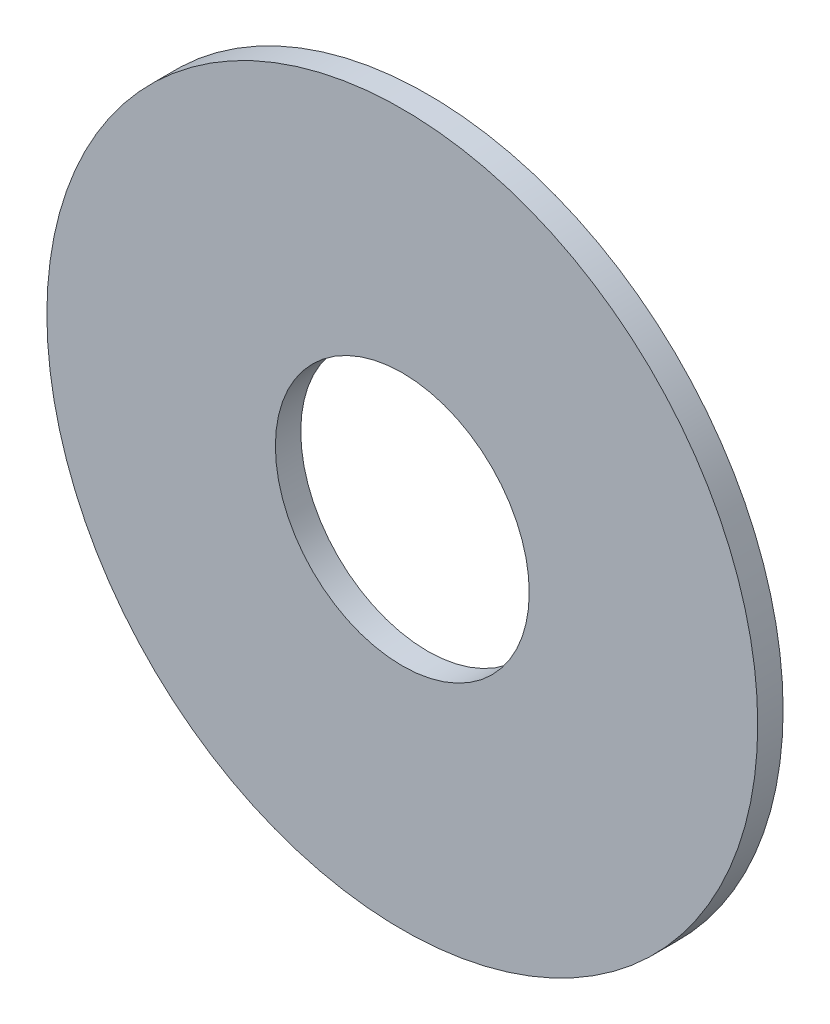
ISO-10303-21;
HEADER;
FILE_DESCRIPTION(('STEP AP214'),'2;1');
FILE_NAME('part.step','',(''),(''),'','','');
FILE_SCHEMA(('AUTOMOTIVE_DESIGN { 1 0 10303 214 1 1 1 1 }'));
ENDSEC;
DATA;
#1=APPLICATION_CONTEXT('core data for automotive mechanical design processes');
#2=APPLICATION_PROTOCOL_DEFINITION('international standard','automotive_design',2000,#1);
#3=PRODUCT_CONTEXT('',#1,'mechanical');
#4=PRODUCT('Part','Part','',(#3));
#5=PRODUCT_RELATED_PRODUCT_CATEGORY('part','',(#4));
#6=PRODUCT_DEFINITION_FORMATION('','',#4);
#7=PRODUCT_DEFINITION_CONTEXT('part definition',#1,'design');
#8=PRODUCT_DEFINITION('design','',#6,#7);
#9=PRODUCT_DEFINITION_SHAPE('','',#8);
#10=(LENGTH_UNIT() NAMED_UNIT(*) SI_UNIT(.MILLI.,.METRE.));
#11=(NAMED_UNIT(*) PLANE_ANGLE_UNIT() SI_UNIT($,.RADIAN.));
#12=(NAMED_UNIT(*) SI_UNIT($,.STERADIAN.) SOLID_ANGLE_UNIT());
#13=UNCERTAINTY_MEASURE_WITH_UNIT(LENGTH_MEASURE(1.E-05),#10,'distance_accuracy_value','');
#14=(GEOMETRIC_REPRESENTATION_CONTEXT(3) GLOBAL_UNCERTAINTY_ASSIGNED_CONTEXT((#13)) GLOBAL_UNIT_ASSIGNED_CONTEXT((#10,
#11,#12)) REPRESENTATION_CONTEXT('',''));
#15=CARTESIAN_POINT('',(0.,0.,0.));
#16=DIRECTION('',(0.,0.,1.));
#17=DIRECTION('',(1.,0.,0.));
#18=AXIS2_PLACEMENT_3D('',#15,#16,#17);
#19=CARTESIAN_POINT('',(0.,0.,10.));
#20=DIRECTION('',(0.,0.,1.));
#21=DIRECTION('',(1.,0.,0.));
#22=AXIS2_PLACEMENT_3D('',#19,#20,#21);
#23=PLANE('',#22);
#24=CARTESIAN_POINT('',(0.,0.,10.));
#25=DIRECTION('',(0.,0.,1.));
#26=DIRECTION('',(1.,0.,0.));
#27=AXIS2_PLACEMENT_3D('',#24,#25,#26);
#28=CIRCLE('',#27,140.);
#29=CARTESIAN_POINT('',(140.,0.,10.));
#30=VERTEX_POINT('',#29);
#31=EDGE_CURVE('E10',#30,#30,#28,.T.);
#32=ORIENTED_EDGE('',*,*,#31,.T.);
#33=EDGE_LOOP('',(#32));
#34=FACE_BOUND('',#33,.T.);
#35=CARTESIAN_POINT('',(0.,0.,10.));
#36=DIRECTION('',(0.,0.,1.));
#37=DIRECTION('',(1.,0.,0.));
#38=AXIS2_PLACEMENT_3D('',#35,#36,#37);
#39=CIRCLE('',#38,50.);
#40=CARTESIAN_POINT('',(50.,0.,10.));
#41=VERTEX_POINT('',#40);
#42=EDGE_CURVE('E48',#41,#41,#39,.T.);
#43=ORIENTED_EDGE('',*,*,#42,.F.);
#44=EDGE_LOOP('',(#43));
#45=FACE_BOUND('',#44,.T.);
#46=ADVANCED_FACE('F37',(#34,#45),#23,.T.);
#47=CARTESIAN_POINT('',(0.,0.,0.));
#48=DIRECTION('',(0.,0.,1.));
#49=DIRECTION('',(1.,0.,0.));
#50=AXIS2_PLACEMENT_3D('',#47,#48,#49);
#51=PLANE('',#50);
#52=CARTESIAN_POINT('',(0.,0.,0.));
#53=DIRECTION('',(0.,0.,1.));
#54=DIRECTION('',(1.,0.,0.));
#55=AXIS2_PLACEMENT_3D('',#52,#53,#54);
#56=CIRCLE('',#55,140.);
#57=CARTESIAN_POINT('',(140.,0.,0.));
#58=VERTEX_POINT('',#57);
#59=EDGE_CURVE('E41',#58,#58,#56,.T.);
#60=ORIENTED_EDGE('',*,*,#59,.F.);
#61=EDGE_LOOP('',(#60));
#62=FACE_BOUND('',#61,.T.);
#63=CARTESIAN_POINT('',(0.,0.,0.));
#64=DIRECTION('',(0.,0.,1.));
#65=DIRECTION('',(1.,0.,0.));
#66=AXIS2_PLACEMENT_3D('',#63,#64,#65);
#67=CIRCLE('',#66,50.);
#68=CARTESIAN_POINT('',(50.,0.,0.));
#69=VERTEX_POINT('',#68);
#70=EDGE_CURVE('E50',#69,#69,#67,.T.);
#71=ORIENTED_EDGE('',*,*,#70,.T.);
#72=EDGE_LOOP('',(#71));
#73=FACE_BOUND('',#72,.T.);
#74=ADVANCED_FACE('F60',(#62,#73),#51,.F.);
#75=CARTESIAN_POINT('',(0.,0.,10.));
#76=DIRECTION('',(0.,0.,-1.));
#77=DIRECTION('',(-1.,0.,0.));
#78=AXIS2_PLACEMENT_3D('',#75,#76,#77);
#79=CYLINDRICAL_SURFACE('',#78,140.);
#80=ORIENTED_EDGE('',*,*,#31,.F.);
#81=EDGE_LOOP('',(#80));
#82=FACE_BOUND('',#81,.T.);
#83=ORIENTED_EDGE('',*,*,#59,.T.);
#84=EDGE_LOOP('',(#83));
#85=FACE_BOUND('',#84,.T.);
#86=ADVANCED_FACE('F39',(#82,#85),#79,.T.);
#87=CARTESIAN_POINT('',(0.,0.,10.));
#88=DIRECTION('',(0.,0.,-1.));
#89=DIRECTION('',(-1.,0.,0.));
#90=AXIS2_PLACEMENT_3D('',#87,#88,#89);
#91=CYLINDRICAL_SURFACE('',#90,50.);
#92=ORIENTED_EDGE('',*,*,#42,.T.);
#93=EDGE_LOOP('',(#92));
#94=FACE_BOUND('',#93,.T.);
#95=ORIENTED_EDGE('',*,*,#70,.F.);
#96=EDGE_LOOP('',(#95));
#97=FACE_BOUND('',#96,.T.);
#98=ADVANCED_FACE('F56',(#94,#97),#91,.F.);
#99=CLOSED_SHELL('',(#46,#74,#86,#98));
#100=MANIFOLD_SOLID_BREP('B2',#99);
#101=ADVANCED_BREP_SHAPE_REPRESENTATION('',(#18,#100),#14);
#102=SHAPE_DEFINITION_REPRESENTATION(#9,#101);
ENDSEC;
END-ISO-10303-21;
